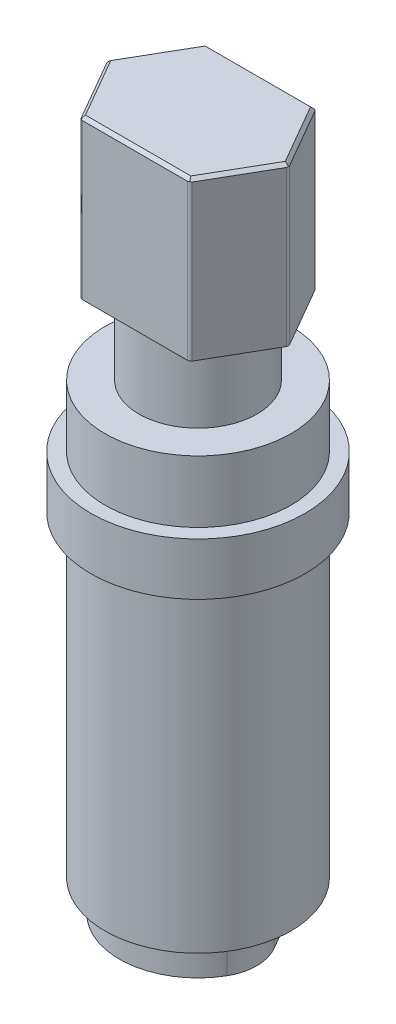
ISO-10303-21;
HEADER;
FILE_DESCRIPTION(('STEP AP214'),'2;1');
FILE_NAME('part.step','',(''),(''),'','','');
FILE_SCHEMA(('AUTOMOTIVE_DESIGN { 1 0 10303 214 1 1 1 1 }'));
ENDSEC;
DATA;
#1=APPLICATION_CONTEXT('core data for automotive mechanical design processes');
#2=APPLICATION_PROTOCOL_DEFINITION('international standard','automotive_design',2000,#1);
#3=PRODUCT_CONTEXT('',#1,'mechanical');
#4=PRODUCT('Part','Part','',(#3));
#5=PRODUCT_RELATED_PRODUCT_CATEGORY('part','',(#4));
#6=PRODUCT_DEFINITION_FORMATION('','',#4);
#7=PRODUCT_DEFINITION_CONTEXT('part definition',#1,'design');
#8=PRODUCT_DEFINITION('design','',#6,#7);
#9=PRODUCT_DEFINITION_SHAPE('','',#8);
#10=(LENGTH_UNIT() NAMED_UNIT(*) SI_UNIT(.MILLI.,.METRE.));
#11=(NAMED_UNIT(*) PLANE_ANGLE_UNIT() SI_UNIT($,.RADIAN.));
#12=(NAMED_UNIT(*) SI_UNIT($,.STERADIAN.) SOLID_ANGLE_UNIT());
#13=UNCERTAINTY_MEASURE_WITH_UNIT(LENGTH_MEASURE(1.E-05),#10,'distance_accuracy_value','');
#14=(GEOMETRIC_REPRESENTATION_CONTEXT(3) GLOBAL_UNCERTAINTY_ASSIGNED_CONTEXT((#13)) GLOBAL_UNIT_ASSIGNED_CONTEXT((#10,
#11,#12)) REPRESENTATION_CONTEXT('',''));
#15=CARTESIAN_POINT('',(0.,0.,0.));
#16=DIRECTION('',(0.,0.,1.));
#17=DIRECTION('',(1.,0.,0.));
#18=AXIS2_PLACEMENT_3D('',#15,#16,#17);
#19=CARTESIAN_POINT('',(0.,19.05,0.));
#20=DIRECTION('',(0.,-1.,0.));
#21=DIRECTION('',(0.,0.,-1.));
#22=AXIS2_PLACEMENT_3D('',#19,#20,#21);
#23=CYLINDRICAL_SURFACE('',#22,3.2004);
#24=CARTESIAN_POINT('',(0.,27.621700408,0.));
#25=DIRECTION('',(0.,-1.,0.));
#26=DIRECTION('',(0.,0.,-1.));
#27=AXIS2_PLACEMENT_3D('',#24,#25,#26);
#28=CIRCLE('',#27,3.2004);
#29=CARTESIAN_POINT('',(0.,27.621700408,-3.2004));
#30=VERTEX_POINT('',#29);
#31=EDGE_CURVE('E312',#30,#30,#28,.T.);
#32=ORIENTED_EDGE('',*,*,#31,.T.);
#33=EDGE_LOOP('',(#32));
#34=FACE_BOUND('',#33,.T.);
#35=CARTESIAN_POINT('',(0.,37.285900282,0.));
#36=DIRECTION('',(0.,1.,0.));
#37=DIRECTION('',(0.,0.,1.));
#38=AXIS2_PLACEMENT_3D('',#35,#36,#37);
#39=CIRCLE('',#38,3.2004);
#40=CARTESIAN_POINT('',(0.,37.285900282,3.2004));
#41=VERTEX_POINT('',#40);
#42=EDGE_CURVE('E316',#41,#41,#39,.F.);
#43=ORIENTED_EDGE('',*,*,#42,.F.);
#44=EDGE_LOOP('',(#43));
#45=FACE_BOUND('',#44,.T.);
#46=ADVANCED_FACE('F17',(#34,#45),#23,.F.);
#47=CARTESIAN_POINT('',(-4.7625,37.285900282,0.));
#48=DIRECTION('',(0.,-1.,0.));
#49=DIRECTION('',(0.,0.,-1.));
#50=AXIS2_PLACEMENT_3D('',#47,#48,#49);
#51=PLANE('',#50);
#52=CARTESIAN_POINT('',(0.,37.285900282,0.));
#53=DIRECTION('',(0.,-1.,0.));
#54=DIRECTION('',(0.,0.,-1.));
#55=AXIS2_PLACEMENT_3D('',#52,#53,#54);
#56=CIRCLE('',#55,7.499999986);
#57=CARTESIAN_POINT('',(0.,37.285900282,-7.499999986));
#58=VERTEX_POINT('',#57);
#59=EDGE_CURVE('E255',#58,#58,#56,.T.);
#60=ORIENTED_EDGE('',*,*,#59,.F.);
#61=EDGE_LOOP('',(#60));
#62=FACE_BOUND('',#61,.T.);
#63=CARTESIAN_POINT('',(0.,37.285900282,0.));
#64=DIRECTION('',(0.,1.,0.));
#65=DIRECTION('',(0.,0.,1.));
#66=AXIS2_PLACEMENT_3D('',#63,#64,#65);
#67=CIRCLE('',#66,4.7625);
#68=CARTESIAN_POINT('',(0.,37.285900282,4.7625));
#69=VERTEX_POINT('',#68);
#70=EDGE_CURVE('E394',#69,#69,#67,.T.);
#71=ORIENTED_EDGE('',*,*,#70,.F.);
#72=EDGE_LOOP('',(#71));
#73=FACE_BOUND('',#72,.T.);
#74=ADVANCED_FACE('F527',(#62,#73),#51,.F.);
#75=CARTESIAN_POINT('',(-3.2004,27.621700408,0.));
#76=DIRECTION('',(0.,-1.,0.));
#77=DIRECTION('',(0.,0.,-1.));
#78=AXIS2_PLACEMENT_3D('',#75,#76,#77);
#79=PLANE('',#78);
#80=CARTESIAN_POINT('',(0.,27.621700408,0.));
#81=DIRECTION('',(0.,-1.,0.));
#82=DIRECTION('',(0.,0.,-1.));
#83=AXIS2_PLACEMENT_3D('',#80,#81,#82);
#84=CIRCLE('',#83,2.5527);
#85=CARTESIAN_POINT('',(0.,27.621700408,-2.5527));
#86=VERTEX_POINT('',#85);
#87=EDGE_CURVE('E263',#86,#86,#84,.T.);
#88=ORIENTED_EDGE('',*,*,#87,.T.);
#89=EDGE_LOOP('',(#88));
#90=FACE_BOUND('',#89,.T.);
#91=ORIENTED_EDGE('',*,*,#31,.F.);
#92=EDGE_LOOP('',(#91));
#93=FACE_BOUND('',#92,.T.);
#94=ADVANCED_FACE('F529',(#90,#93),#79,.F.);
#95=CARTESIAN_POINT('',(-7.499999986,2.54,0.));
#96=DIRECTION('',(0.,1.,0.));
#97=DIRECTION('',(0.,0.,1.));
#98=AXIS2_PLACEMENT_3D('',#95,#96,#97);
#99=PLANE('',#98);
#100=CARTESIAN_POINT('',(0.,2.54,0.));
#101=DIRECTION('',(0.,-1.,0.));
#102=DIRECTION('',(0.,0.,-1.));
#103=AXIS2_PLACEMENT_3D('',#100,#101,#102);
#104=CIRCLE('',#103,7.499999986);
#105=CARTESIAN_POINT('',(0.,2.54,-7.499999986));
#106=VERTEX_POINT('',#105);
#107=EDGE_CURVE('E296',#106,#106,#104,.T.);
#108=ORIENTED_EDGE('',*,*,#107,.T.);
#109=EDGE_LOOP('',(#108));
#110=FACE_BOUND('',#109,.T.);
#111=DIRECTION('',(0.5,0.,-0.866025403784439));
#112=VECTOR('',#111,1.);
#113=CARTESIAN_POINT('',(-5.49926131403119,2.54,-0.635));
#114=LINE('',#113,#112);
#115=CARTESIAN_POINT('',(-5.49926131403119,2.54,-0.635));
#116=VERTEX_POINT('',#115);
#117=CARTESIAN_POINT('',(-3.29955678841871,2.54,-4.445));
#118=VERTEX_POINT('',#117);
#119=EDGE_CURVE('E245',#116,#118,#114,.T.);
#120=ORIENTED_EDGE('',*,*,#119,.F.);
#121=CARTESIAN_POINT('',(-2.19970452561247,2.54,1.27));
#122=DIRECTION('',(0.,1.,0.));
#123=DIRECTION('',(0.,0.,1.));
#124=AXIS2_PLACEMENT_3D('',#121,#122,#123);
#125=CIRCLE('',#124,3.81);
#126=CARTESIAN_POINT('',(-5.49926131403119,2.54,3.175));
#127=VERTEX_POINT('',#126);
#128=EDGE_CURVE('E252',#127,#116,#125,.F.);
#129=ORIENTED_EDGE('',*,*,#128,.F.);
#130=CARTESIAN_POINT('',(0.,2.54,0.));
#131=DIRECTION('',(0.,1.,0.));
#132=DIRECTION('',(0.,0.,1.));
#133=AXIS2_PLACEMENT_3D('',#130,#131,#132);
#134=CIRCLE('',#133,6.35);
#135=CARTESIAN_POINT('',(5.49926131403119,2.54,3.175));
#136=VERTEX_POINT('',#135);
#137=EDGE_CURVE('E256',#136,#127,#134,.F.);
#138=ORIENTED_EDGE('',*,*,#137,.F.);
#139=CARTESIAN_POINT('',(2.19970452561247,2.54,1.27));
#140=DIRECTION('',(0.,1.,0.));
#141=DIRECTION('',(0.,0.,1.));
#142=AXIS2_PLACEMENT_3D('',#139,#140,#141);
#143=CIRCLE('',#142,3.81);
#144=CARTESIAN_POINT('',(5.49926131403119,2.54,-0.635));
#145=VERTEX_POINT('',#144);
#146=EDGE_CURVE('E239',#145,#136,#143,.F.);
#147=ORIENTED_EDGE('',*,*,#146,.F.);
#148=DIRECTION('',(0.5,0.,0.866025403784439));
#149=VECTOR('',#148,1.);
#150=CARTESIAN_POINT('',(3.29955678841871,2.54,-4.445));
#151=LINE('',#150,#149);
#152=CARTESIAN_POINT('',(3.29955678841871,2.54,-4.445));
#153=VERTEX_POINT('',#152);
#154=EDGE_CURVE('E224',#153,#145,#151,.T.);
#155=ORIENTED_EDGE('',*,*,#154,.F.);
#156=CARTESIAN_POINT('',(0.,2.54,-2.54));
#157=DIRECTION('',(0.,1.,0.));
#158=DIRECTION('',(0.,0.,1.));
#159=AXIS2_PLACEMENT_3D('',#156,#157,#158);
#160=CIRCLE('',#159,3.81);
#161=EDGE_CURVE('E236',#118,#153,#160,.F.);
#162=ORIENTED_EDGE('',*,*,#161,.F.);
#163=EDGE_LOOP('',(#120,#129,#138,#147,#155,#162));
#164=FACE_BOUND('',#163,.T.);
#165=ADVANCED_FACE('F235',(#110,#164),#99,.F.);
#166=CARTESIAN_POINT('',(0.,19.05,0.));
#167=DIRECTION('',(0.,-1.,0.));
#168=DIRECTION('',(0.,0.,-1.));
#169=AXIS2_PLACEMENT_3D('',#166,#167,#168);
#170=CYLINDRICAL_SURFACE('',#169,7.499999986);
#171=ORIENTED_EDGE('',*,*,#107,.F.);
#172=EDGE_LOOP('',(#171));
#173=FACE_BOUND('',#172,.T.);
#174=CARTESIAN_POINT('',(0.,28.067,0.));
#175=DIRECTION('',(0.,-1.,0.));
#176=DIRECTION('',(0.,0.,-1.));
#177=AXIS2_PLACEMENT_3D('',#174,#175,#176);
#178=CIRCLE('',#177,7.499999986);
#179=CARTESIAN_POINT('',(0.,28.067,-7.499999986));
#180=VERTEX_POINT('',#179);
#181=EDGE_CURVE('E292',#180,#180,#178,.T.);
#182=ORIENTED_EDGE('',*,*,#181,.T.);
#183=EDGE_LOOP('',(#182));
#184=FACE_BOUND('',#183,.T.);
#185=ADVANCED_FACE('F560',(#173,#184),#170,.T.);
#186=CARTESIAN_POINT('',(-8.636,28.067,0.));
#187=DIRECTION('',(0.,1.,0.));
#188=DIRECTION('',(0.,0.,1.));
#189=AXIS2_PLACEMENT_3D('',#186,#187,#188);
#190=PLANE('',#189);
#191=ORIENTED_EDGE('',*,*,#181,.F.);
#192=EDGE_LOOP('',(#191));
#193=FACE_BOUND('',#192,.T.);
#194=CARTESIAN_POINT('',(0.,28.067,0.));
#195=DIRECTION('',(0.,-1.,0.));
#196=DIRECTION('',(0.,0.,-1.));
#197=AXIS2_PLACEMENT_3D('',#194,#195,#196);
#198=CIRCLE('',#197,8.636);
#199=CARTESIAN_POINT('',(0.,28.067,-8.636));
#200=VERTEX_POINT('',#199);
#201=EDGE_CURVE('E288',#200,#200,#198,.T.);
#202=ORIENTED_EDGE('',*,*,#201,.T.);
#203=EDGE_LOOP('',(#202));
#204=FACE_BOUND('',#203,.T.);
#205=ADVANCED_FACE('F556',(#193,#204),#190,.F.);
#206=CARTESIAN_POINT('',(0.,19.05,0.));
#207=DIRECTION('',(0.,-1.,0.));
#208=DIRECTION('',(0.,0.,-1.));
#209=AXIS2_PLACEMENT_3D('',#206,#207,#208);
#210=CYLINDRICAL_SURFACE('',#209,8.636);
#211=ORIENTED_EDGE('',*,*,#201,.F.);
#212=EDGE_LOOP('',(#211));
#213=FACE_BOUND('',#212,.T.);
#214=CARTESIAN_POINT('',(0.,32.285900376,0.));
#215=DIRECTION('',(0.,-1.,0.));
#216=DIRECTION('',(0.,0.,-1.));
#217=AXIS2_PLACEMENT_3D('',#214,#215,#216);
#218=CIRCLE('',#217,8.636);
#219=CARTESIAN_POINT('',(0.,32.285900376,-8.636));
#220=VERTEX_POINT('',#219);
#221=EDGE_CURVE('E284',#220,#220,#218,.T.);
#222=ORIENTED_EDGE('',*,*,#221,.T.);
#223=EDGE_LOOP('',(#222));
#224=FACE_BOUND('',#223,.T.);
#225=ADVANCED_FACE('F552',(#213,#224),#210,.T.);
#226=CARTESIAN_POINT('',(-8.636,32.285900376,0.));
#227=DIRECTION('',(0.,-1.,0.));
#228=DIRECTION('',(0.,0.,-1.));
#229=AXIS2_PLACEMENT_3D('',#226,#227,#228);
#230=PLANE('',#229);
#231=ORIENTED_EDGE('',*,*,#221,.F.);
#232=EDGE_LOOP('',(#231));
#233=FACE_BOUND('',#232,.T.);
#234=CARTESIAN_POINT('',(0.,32.285900376,0.));
#235=DIRECTION('',(0.,-1.,0.));
#236=DIRECTION('',(0.,0.,-1.));
#237=AXIS2_PLACEMENT_3D('',#234,#235,#236);
#238=CIRCLE('',#237,7.499999986);
#239=CARTESIAN_POINT('',(0.,32.285900376,-7.499999986));
#240=VERTEX_POINT('',#239);
#241=EDGE_CURVE('E280',#240,#240,#238,.T.);
#242=ORIENTED_EDGE('',*,*,#241,.T.);
#243=EDGE_LOOP('',(#242));
#244=FACE_BOUND('',#243,.T.);
#245=ADVANCED_FACE('F548',(#233,#244),#230,.F.);
#246=CARTESIAN_POINT('',(0.,19.05,0.));
#247=DIRECTION('',(0.,-1.,0.));
#248=DIRECTION('',(0.,0.,-1.));
#249=AXIS2_PLACEMENT_3D('',#246,#247,#248);
#250=CYLINDRICAL_SURFACE('',#249,7.499999986);
#251=ORIENTED_EDGE('',*,*,#241,.F.);
#252=EDGE_LOOP('',(#251));
#253=FACE_BOUND('',#252,.T.);
#254=ORIENTED_EDGE('',*,*,#59,.T.);
#255=EDGE_LOOP('',(#254));
#256=FACE_BOUND('',#255,.T.);
#257=ADVANCED_FACE('F545',(#253,#256),#250,.T.);
#258=CARTESIAN_POINT('',(0.,23.6095192980614,-2.54));
#259=DIRECTION('',(0.,-1.,0.));
#260=DIRECTION('',(0.,0.,-1.));
#261=AXIS2_PLACEMENT_3D('',#258,#259,#260);
#262=CYLINDRICAL_SURFACE('',#261,3.81);
#263=ORIENTED_EDGE('',*,*,#161,.T.);
#264=DIRECTION('',(0.,-1.,0.));
#265=VECTOR('',#264,1.);
#266=CARTESIAN_POINT('',(3.29955678841871,23.6095192980614,-4.445));
#267=LINE('',#266,#265);
#268=CARTESIAN_POINT('',(3.29955678841871,0.,-4.445));
#269=VERTEX_POINT('',#268);
#270=EDGE_CURVE('E220',#153,#269,#267,.T.);
#271=ORIENTED_EDGE('',*,*,#270,.T.);
#272=CARTESIAN_POINT('',(0.,0.,-2.54));
#273=DIRECTION('',(0.,-1.,0.));
#274=DIRECTION('',(0.,0.,-1.));
#275=AXIS2_PLACEMENT_3D('',#272,#273,#274);
#276=CIRCLE('',#275,3.81);
#277=CARTESIAN_POINT('',(-3.29955678841871,0.,-4.445));
#278=VERTEX_POINT('',#277);
#279=EDGE_CURVE('E249',#278,#269,#276,.T.);
#280=ORIENTED_EDGE('',*,*,#279,.F.);
#281=DIRECTION('',(0.,-1.,0.));
#282=VECTOR('',#281,1.);
#283=CARTESIAN_POINT('',(-3.29955678841871,23.6095192980614,-4.445));
#284=LINE('',#283,#282);
#285=EDGE_CURVE('E243',#118,#278,#284,.T.);
#286=ORIENTED_EDGE('',*,*,#285,.F.);
#287=EDGE_LOOP('',(#263,#271,#280,#286));
#288=FACE_BOUND('',#287,.T.);
#289=ADVANCED_FACE('F242',(#288),#262,.T.);
#290=CARTESIAN_POINT('',(-5.49926131403119,23.6095192980614,-0.635));
#291=DIRECTION('',(-0.866025403784439,0.,-0.5));
#292=DIRECTION('',(-0.5,0.,0.866025403784439));
#293=AXIS2_PLACEMENT_3D('',#290,#291,#292);
#294=PLANE('',#293);
#295=ORIENTED_EDGE('',*,*,#119,.T.);
#296=ORIENTED_EDGE('',*,*,#285,.T.);
#297=DIRECTION('',(0.5,0.,-0.866025403784439));
#298=VECTOR('',#297,1.);
#299=CARTESIAN_POINT('',(-5.49926131403119,0.,-0.635));
#300=LINE('',#299,#298);
#301=CARTESIAN_POINT('',(-5.49926131403119,0.,-0.635));
#302=VERTEX_POINT('',#301);
#303=EDGE_CURVE('E266',#302,#278,#300,.T.);
#304=ORIENTED_EDGE('',*,*,#303,.F.);
#305=DIRECTION('',(0.,-1.,0.));
#306=VECTOR('',#305,1.);
#307=CARTESIAN_POINT('',(-5.49926131403119,23.6095192980614,-0.635));
#308=LINE('',#307,#306);
#309=EDGE_CURVE('E264',#116,#302,#308,.T.);
#310=ORIENTED_EDGE('',*,*,#309,.F.);
#311=EDGE_LOOP('',(#295,#296,#304,#310));
#312=FACE_BOUND('',#311,.T.);
#313=ADVANCED_FACE('F730',(#312),#294,.T.);
#314=CARTESIAN_POINT('',(-2.19970452561247,23.6095192980614,1.27));
#315=DIRECTION('',(0.,-1.,0.));
#316=DIRECTION('',(0.,0.,-1.));
#317=AXIS2_PLACEMENT_3D('',#314,#315,#316);
#318=CYLINDRICAL_SURFACE('',#317,3.81);
#319=ORIENTED_EDGE('',*,*,#128,.T.);
#320=ORIENTED_EDGE('',*,*,#309,.T.);
#321=CARTESIAN_POINT('',(-2.19970452561247,0.,1.27));
#322=DIRECTION('',(0.,-1.,0.));
#323=DIRECTION('',(0.,0.,-1.));
#324=AXIS2_PLACEMENT_3D('',#321,#322,#323);
#325=CIRCLE('',#324,3.81);
#326=CARTESIAN_POINT('',(-5.49926131403119,0.,3.175));
#327=VERTEX_POINT('',#326);
#328=EDGE_CURVE('E269',#327,#302,#325,.T.);
#329=ORIENTED_EDGE('',*,*,#328,.F.);
#330=DIRECTION('',(0.,-1.,0.));
#331=VECTOR('',#330,1.);
#332=CARTESIAN_POINT('',(-5.49926131403119,23.6095192980614,3.175));
#333=LINE('',#332,#331);
#334=EDGE_CURVE('E267',#127,#327,#333,.T.);
#335=ORIENTED_EDGE('',*,*,#334,.F.);
#336=EDGE_LOOP('',(#319,#320,#329,#335));
#337=FACE_BOUND('',#336,.T.);
#338=ADVANCED_FACE('F727',(#337),#318,.T.);
#339=CARTESIAN_POINT('',(0.,23.6095192980614,0.));
#340=DIRECTION('',(0.,-1.,0.));
#341=DIRECTION('',(0.,0.,-1.));
#342=AXIS2_PLACEMENT_3D('',#339,#340,#341);
#343=CYLINDRICAL_SURFACE('',#342,6.35);
#344=ORIENTED_EDGE('',*,*,#137,.T.);
#345=ORIENTED_EDGE('',*,*,#334,.T.);
#346=CARTESIAN_POINT('',(0.,0.,0.));
#347=DIRECTION('',(0.,-1.,0.));
#348=DIRECTION('',(0.,0.,-1.));
#349=AXIS2_PLACEMENT_3D('',#346,#347,#348);
#350=CIRCLE('',#349,6.35);
#351=CARTESIAN_POINT('',(5.49926131403119,0.,3.175));
#352=VERTEX_POINT('',#351);
#353=EDGE_CURVE('E273',#352,#327,#350,.T.);
#354=ORIENTED_EDGE('',*,*,#353,.F.);
#355=DIRECTION('',(0.,-1.,0.));
#356=VECTOR('',#355,1.);
#357=CARTESIAN_POINT('',(5.49926131403119,23.6095192980614,3.175));
#358=LINE('',#357,#356);
#359=EDGE_CURVE('E270',#136,#352,#358,.T.);
#360=ORIENTED_EDGE('',*,*,#359,.F.);
#361=EDGE_LOOP('',(#344,#345,#354,#360));
#362=FACE_BOUND('',#361,.T.);
#363=ADVANCED_FACE('F723',(#362),#343,.T.);
#364=CARTESIAN_POINT('',(2.19970452561247,23.6095192980614,1.27));
#365=DIRECTION('',(0.,-1.,0.));
#366=DIRECTION('',(0.,0.,-1.));
#367=AXIS2_PLACEMENT_3D('',#364,#365,#366);
#368=CYLINDRICAL_SURFACE('',#367,3.81);
#369=ORIENTED_EDGE('',*,*,#146,.T.);
#370=ORIENTED_EDGE('',*,*,#359,.T.);
#371=CARTESIAN_POINT('',(2.19970452561247,0.,1.27));
#372=DIRECTION('',(0.,-1.,0.));
#373=DIRECTION('',(0.,0.,-1.));
#374=AXIS2_PLACEMENT_3D('',#371,#372,#373);
#375=CIRCLE('',#374,3.81);
#376=CARTESIAN_POINT('',(5.49926131403119,0.,-0.635));
#377=VERTEX_POINT('',#376);
#378=EDGE_CURVE('E231',#377,#352,#375,.T.);
#379=ORIENTED_EDGE('',*,*,#378,.F.);
#380=DIRECTION('',(0.,-1.,0.));
#381=VECTOR('',#380,1.);
#382=CARTESIAN_POINT('',(5.49926131403119,23.6095192980614,-0.635));
#383=LINE('',#382,#381);
#384=EDGE_CURVE('E274',#145,#377,#383,.T.);
#385=ORIENTED_EDGE('',*,*,#384,.F.);
#386=EDGE_LOOP('',(#369,#370,#379,#385));
#387=FACE_BOUND('',#386,.T.);
#388=ADVANCED_FACE('F720',(#387),#368,.T.);
#389=CARTESIAN_POINT('',(3.29955678841871,23.6095192980614,-4.445));
#390=DIRECTION('',(0.866025403784439,0.,-0.5));
#391=DIRECTION('',(-0.5,0.,-0.866025403784439));
#392=AXIS2_PLACEMENT_3D('',#389,#390,#391);
#393=PLANE('',#392);
#394=ORIENTED_EDGE('',*,*,#154,.T.);
#395=ORIENTED_EDGE('',*,*,#384,.T.);
#396=DIRECTION('',(0.5,0.,0.866025403784439));
#397=VECTOR('',#396,1.);
#398=CARTESIAN_POINT('',(3.29955678841871,0.,-4.445));
#399=LINE('',#398,#397);
#400=EDGE_CURVE('E226',#269,#377,#399,.T.);
#401=ORIENTED_EDGE('',*,*,#400,.F.);
#402=ORIENTED_EDGE('',*,*,#270,.F.);
#403=EDGE_LOOP('',(#394,#395,#401,#402));
#404=FACE_BOUND('',#403,.T.);
#405=ADVANCED_FACE('F222',(#404),#393,.T.);
#406=CARTESIAN_POINT('',(0.,19.05,0.));
#407=DIRECTION('',(0.,-1.,0.));
#408=DIRECTION('',(0.,0.,-1.));
#409=AXIS2_PLACEMENT_3D('',#406,#407,#408);
#410=CYLINDRICAL_SURFACE('',#409,2.5527);
#411=CARTESIAN_POINT('',(0.,6.35,0.));
#412=DIRECTION('',(0.,-1.,0.));
#413=DIRECTION('',(0.,0.,-1.));
#414=AXIS2_PLACEMENT_3D('',#411,#412,#413);
#415=CIRCLE('',#414,2.5527);
#416=CARTESIAN_POINT('',(0.,6.35,-2.5527));
#417=VERTEX_POINT('',#416);
#418=EDGE_CURVE('E308',#417,#417,#415,.T.);
#419=ORIENTED_EDGE('',*,*,#418,.T.);
#420=EDGE_LOOP('',(#419));
#421=FACE_BOUND('',#420,.T.);
#422=ORIENTED_EDGE('',*,*,#87,.F.);
#423=EDGE_LOOP('',(#422));
#424=FACE_BOUND('',#423,.T.);
#425=ADVANCED_FACE('F580',(#421,#424),#410,.F.);
#426=CARTESIAN_POINT('',(-2.5527,6.35,0.));
#427=DIRECTION('',(0.,1.,0.));
#428=DIRECTION('',(0.,0.,1.));
#429=AXIS2_PLACEMENT_3D('',#426,#427,#428);
#430=PLANE('',#429);
#431=ORIENTED_EDGE('',*,*,#418,.F.);
#432=EDGE_LOOP('',(#431));
#433=FACE_BOUND('',#432,.T.);
#434=CARTESIAN_POINT('',(0.,6.35,0.));
#435=DIRECTION('',(0.,-1.,0.));
#436=DIRECTION('',(0.,0.,-1.));
#437=AXIS2_PLACEMENT_3D('',#434,#435,#436);
#438=CIRCLE('',#437,3.2639);
#439=CARTESIAN_POINT('',(0.,6.35,-3.2639));
#440=VERTEX_POINT('',#439);
#441=EDGE_CURVE('E304',#440,#440,#438,.T.);
#442=ORIENTED_EDGE('',*,*,#441,.T.);
#443=EDGE_LOOP('',(#442));
#444=FACE_BOUND('',#443,.T.);
#445=ADVANCED_FACE('F576',(#433,#444),#430,.F.);
#446=CARTESIAN_POINT('',(0.,19.05,0.));
#447=DIRECTION('',(0.,-1.,0.));
#448=DIRECTION('',(0.,0.,-1.));
#449=AXIS2_PLACEMENT_3D('',#446,#447,#448);
#450=CYLINDRICAL_SURFACE('',#449,3.2639);
#451=ORIENTED_EDGE('',*,*,#441,.F.);
#452=EDGE_LOOP('',(#451));
#453=FACE_BOUND('',#452,.T.);
#454=CARTESIAN_POINT('',(0.,0.,0.));
#455=DIRECTION('',(0.,-1.,0.));
#456=DIRECTION('',(0.,0.,-1.));
#457=AXIS2_PLACEMENT_3D('',#454,#455,#456);
#458=CIRCLE('',#457,3.2639);
#459=CARTESIAN_POINT('',(0.,0.,-3.2639));
#460=VERTEX_POINT('',#459);
#461=EDGE_CURVE('E300',#460,#460,#458,.T.);
#462=ORIENTED_EDGE('',*,*,#461,.T.);
#463=EDGE_LOOP('',(#462));
#464=FACE_BOUND('',#463,.T.);
#465=ADVANCED_FACE('F572',(#453,#464),#450,.F.);
#466=CARTESIAN_POINT('',(-7.449199986,0.,0.));
#467=DIRECTION('',(0.,1.,0.));
#468=DIRECTION('',(0.,0.,1.));
#469=AXIS2_PLACEMENT_3D('',#466,#467,#468);
#470=PLANE('',#469);
#471=ORIENTED_EDGE('',*,*,#461,.F.);
#472=EDGE_LOOP('',(#471));
#473=FACE_BOUND('',#472,.T.);
#474=ORIENTED_EDGE('',*,*,#279,.T.);
#475=ORIENTED_EDGE('',*,*,#400,.T.);
#476=ORIENTED_EDGE('',*,*,#378,.T.);
#477=ORIENTED_EDGE('',*,*,#353,.T.);
#478=ORIENTED_EDGE('',*,*,#328,.T.);
#479=ORIENTED_EDGE('',*,*,#303,.T.);
#480=EDGE_LOOP('',(#474,#475,#476,#477,#478,#479));
#481=FACE_BOUND('',#480,.T.);
#482=ADVANCED_FACE('F568',(#473,#481),#470,.F.);
#483=CARTESIAN_POINT('',(0.,37.285900282,0.));
#484=DIRECTION('',(0.,1.,0.));
#485=DIRECTION('',(0.,0.,1.));
#486=AXIS2_PLACEMENT_3D('',#483,#484,#485);
#487=PLANE('',#486);
#488=ORIENTED_EDGE('',*,*,#42,.T.);
#489=EDGE_LOOP('',(#488));
#490=FACE_BOUND('',#489,.T.);
#491=ADVANCED_FACE('F571',(#490),#487,.F.);
#492=CARTESIAN_POINT('',(0.,43.318400282,0.));
#493=DIRECTION('',(0.,1.,0.));
#494=DIRECTION('',(0.,0.,1.));
#495=AXIS2_PLACEMENT_3D('',#492,#493,#494);
#496=PLANE('',#495);
#497=CARTESIAN_POINT('',(0.,43.318400282,0.));
#498=DIRECTION('',(0.,1.,0.));
#499=DIRECTION('',(0.,0.,1.));
#500=AXIS2_PLACEMENT_3D('',#497,#498,#499);
#501=CIRCLE('',#500,4.7625);
#502=CARTESIAN_POINT('',(0.,43.318400282,4.7625));
#503=VERTEX_POINT('',#502);
#504=EDGE_CURVE('E492',#503,#503,#501,.T.);
#505=ORIENTED_EDGE('',*,*,#504,.T.);
#506=EDGE_LOOP('',(#505));
#507=FACE_BOUND('',#506,.T.);
#508=DIRECTION('',(1.,0.,0.));
#509=VECTOR('',#508,1.);
#510=CARTESIAN_POINT('',(-4.39940905122495,43.318400282,5.08));
#511=LINE('',#510,#509);
#512=CARTESIAN_POINT('',(-4.25276208285078,43.318400282,5.08));
#513=VERTEX_POINT('',#512);
#514=CARTESIAN_POINT('',(4.25276208285078,43.318400282,5.08));
#515=VERTEX_POINT('',#514);
#516=EDGE_CURVE('E320',#513,#515,#511,.T.);
#517=ORIENTED_EDGE('',*,*,#516,.F.);
#518=CARTESIAN_POINT('',(-4.25276208285078,43.318400282,4.826));
#519=DIRECTION('',(0.,1.,0.));
#520=DIRECTION('',(0.,0.,1.));
#521=AXIS2_PLACEMENT_3D('',#518,#519,#520);
#522=CIRCLE('',#521,0.254);
#523=CARTESIAN_POINT('',(-4.47273253541204,43.318400282,4.953));
#524=VERTEX_POINT('',#523);
#525=EDGE_CURVE('E436',#513,#524,#522,.F.);
#526=ORIENTED_EDGE('',*,*,#525,.T.);
#527=DIRECTION('',(0.5,0.,0.866025403784439));
#528=VECTOR('',#527,1.);
#529=CARTESIAN_POINT('',(-7.33234841870825,43.318400282,0.));
#530=LINE('',#529,#528);
#531=CARTESIAN_POINT('',(-7.25902493452117,43.318400282,0.127));
#532=VERTEX_POINT('',#531);
#533=EDGE_CURVE('E489',#532,#524,#530,.T.);
#534=ORIENTED_EDGE('',*,*,#533,.F.);
#535=CARTESIAN_POINT('',(-7.03905448195992,43.318400282,0.));
#536=DIRECTION('',(0.,1.,0.));
#537=DIRECTION('',(0.,0.,1.));
#538=AXIS2_PLACEMENT_3D('',#535,#536,#537);
#539=CIRCLE('',#538,0.254);
#540=CARTESIAN_POINT('',(-7.25902493452117,43.318400282,-0.127));
#541=VERTEX_POINT('',#540);
#542=EDGE_CURVE('E424',#532,#541,#539,.F.);
#543=ORIENTED_EDGE('',*,*,#542,.T.);
#544=DIRECTION('',(-0.5,0.,0.866025403784439));
#545=VECTOR('',#544,1.);
#546=CARTESIAN_POINT('',(-3.66617420935412,43.318400282,-6.35));
#547=LINE('',#546,#545);
#548=CARTESIAN_POINT('',(-4.47273253541204,43.318400282,-4.953));
#549=VERTEX_POINT('',#548);
#550=EDGE_CURVE('E487',#549,#541,#547,.T.);
#551=ORIENTED_EDGE('',*,*,#550,.F.);
#552=CARTESIAN_POINT('',(-4.25276208285078,43.318400282,-4.826));
#553=DIRECTION('',(0.,1.,0.));
#554=DIRECTION('',(0.,0.,1.));
#555=AXIS2_PLACEMENT_3D('',#552,#553,#554);
#556=CIRCLE('',#555,0.254);
#557=CARTESIAN_POINT('',(-4.25276208285078,43.318400282,-5.08));
#558=VERTEX_POINT('',#557);
#559=EDGE_CURVE('E427',#549,#558,#556,.F.);
#560=ORIENTED_EDGE('',*,*,#559,.T.);
#561=DIRECTION('',(-1.,0.,0.));
#562=VECTOR('',#561,1.);
#563=CARTESIAN_POINT('',(-4.39940905122495,43.318400282,-5.08));
#564=LINE('',#563,#562);
#565=CARTESIAN_POINT('',(4.25276208285078,43.318400282,-5.08));
#566=VERTEX_POINT('',#565);
#567=EDGE_CURVE('E324',#566,#558,#564,.T.);
#568=ORIENTED_EDGE('',*,*,#567,.F.);
#569=CARTESIAN_POINT('',(4.25276208285078,43.318400282,-4.826));
#570=DIRECTION('',(0.,1.,0.));
#571=DIRECTION('',(0.,0.,1.));
#572=AXIS2_PLACEMENT_3D('',#569,#570,#571);
#573=CIRCLE('',#572,0.254);
#574=CARTESIAN_POINT('',(4.47273253541203,43.318400282,-4.953));
#575=VERTEX_POINT('',#574);
#576=EDGE_CURVE('E430',#566,#575,#573,.F.);
#577=ORIENTED_EDGE('',*,*,#576,.T.);
#578=DIRECTION('',(-0.5,0.,-0.866025403784439));
#579=VECTOR('',#578,1.);
#580=CARTESIAN_POINT('',(7.33234841870825,43.318400282,0.));
#581=LINE('',#580,#579);
#582=CARTESIAN_POINT('',(7.25902493452117,43.318400282,-0.127000000000004));
#583=VERTEX_POINT('',#582);
#584=EDGE_CURVE('E490',#583,#575,#581,.T.);
#585=ORIENTED_EDGE('',*,*,#584,.F.);
#586=CARTESIAN_POINT('',(7.03905448195992,43.318400282,0.));
#587=DIRECTION('',(0.,1.,0.));
#588=DIRECTION('',(0.,0.,1.));
#589=AXIS2_PLACEMENT_3D('',#586,#587,#588);
#590=CIRCLE('',#589,0.254);
#591=CARTESIAN_POINT('',(7.25902493452117,43.318400282,0.126999999999997));
#592=VERTEX_POINT('',#591);
#593=EDGE_CURVE('E433',#583,#592,#590,.F.);
#594=ORIENTED_EDGE('',*,*,#593,.T.);
#595=DIRECTION('',(0.5,0.,-0.866025403784439));
#596=VECTOR('',#595,1.);
#597=CARTESIAN_POINT('',(3.66617420935412,43.318400282,6.35));
#598=LINE('',#597,#596);
#599=CARTESIAN_POINT('',(4.47273253541203,43.318400282,4.953));
#600=VERTEX_POINT('',#599);
#601=EDGE_CURVE('E496',#600,#592,#598,.T.);
#602=ORIENTED_EDGE('',*,*,#601,.F.);
#603=CARTESIAN_POINT('',(4.25276208285078,43.318400282,4.826));
#604=DIRECTION('',(0.,1.,0.));
#605=DIRECTION('',(0.,0.,1.));
#606=AXIS2_PLACEMENT_3D('',#603,#604,#605);
#607=CIRCLE('',#606,0.254);
#608=EDGE_CURVE('E421',#600,#515,#607,.F.);
#609=ORIENTED_EDGE('',*,*,#608,.T.);
#610=EDGE_LOOP('',(#517,#526,#534,#543,#551,#560,#568,#577,#585,#594,#602,#609));
#611=FACE_BOUND('',#610,.T.);
#612=ADVANCED_FACE('F669',(#507,#611),#496,.F.);
#613=CARTESIAN_POINT('',(0.,43.318400282,0.));
#614=DIRECTION('',(0.,-1.,0.));
#615=DIRECTION('',(0.,0.,-1.));
#616=AXIS2_PLACEMENT_3D('',#613,#614,#615);
#617=CYLINDRICAL_SURFACE('',#616,4.7625);
#618=ORIENTED_EDGE('',*,*,#504,.F.);
#619=EDGE_LOOP('',(#618));
#620=FACE_BOUND('',#619,.T.);
#621=ORIENTED_EDGE('',*,*,#70,.T.);
#622=EDGE_LOOP('',(#621));
#623=FACE_BOUND('',#622,.T.);
#624=ADVANCED_FACE('F525',(#620,#623),#617,.T.);
#625=CARTESIAN_POINT('',(0.,56.081900282,0.));
#626=DIRECTION('',(0.,1.,0.));
#627=DIRECTION('',(0.,0.,1.));
#628=AXIS2_PLACEMENT_3D('',#625,#626,#627);
#629=PLANE('',#628);
#630=DIRECTION('',(0.5,0.,-0.866025403784439));
#631=VECTOR('',#630,1.);
#632=CARTESIAN_POINT('',(7.112377966147,56.081900282,-0.127000000000002));
#633=LINE('',#632,#631);
#634=CARTESIAN_POINT('',(4.25276208285078,56.081900282,4.826));
#635=VERTEX_POINT('',#634);
#636=CARTESIAN_POINT('',(7.03905448195992,56.081900282,0.));
#637=VERTEX_POINT('',#636);
#638=EDGE_CURVE('E342',#635,#637,#633,.T.);
#639=ORIENTED_EDGE('',*,*,#638,.T.);
#640=DIRECTION('',(-0.5,0.,-0.866025403784439));
#641=VECTOR('',#640,1.);
#642=CARTESIAN_POINT('',(4.17943859866371,56.081900282,-4.953));
#643=LINE('',#642,#641);
#644=CARTESIAN_POINT('',(4.25276208285078,56.081900282,-4.826));
#645=VERTEX_POINT('',#644);
#646=EDGE_CURVE('E345',#637,#645,#643,.T.);
#647=ORIENTED_EDGE('',*,*,#646,.T.);
#648=DIRECTION('',(-1.,0.,0.));
#649=VECTOR('',#648,1.);
#650=CARTESIAN_POINT('',(-4.39940905122495,56.081900282,-4.826));
#651=LINE('',#650,#649);
#652=CARTESIAN_POINT('',(-4.25276208285079,56.081900282,-4.826));
#653=VERTEX_POINT('',#652);
#654=EDGE_CURVE('E328',#645,#653,#651,.T.);
#655=ORIENTED_EDGE('',*,*,#654,.T.);
#656=DIRECTION('',(-0.5,0.,0.866025403784439));
#657=VECTOR('',#656,1.);
#658=CARTESIAN_POINT('',(-7.112377966147,56.081900282,0.126999999999998));
#659=LINE('',#658,#657);
#660=CARTESIAN_POINT('',(-7.03905448195992,56.081900282,0.));
#661=VERTEX_POINT('',#660);
#662=EDGE_CURVE('E332',#653,#661,#659,.T.);
#663=ORIENTED_EDGE('',*,*,#662,.T.);
#664=DIRECTION('',(0.5,0.,0.866025403784439));
#665=VECTOR('',#664,1.);
#666=CARTESIAN_POINT('',(-4.17943859866371,56.081900282,4.953));
#667=LINE('',#666,#665);
#668=CARTESIAN_POINT('',(-4.25276208285079,56.081900282,4.826));
#669=VERTEX_POINT('',#668);
#670=EDGE_CURVE('E336',#661,#669,#667,.T.);
#671=ORIENTED_EDGE('',*,*,#670,.T.);
#672=DIRECTION('',(1.,0.,0.));
#673=VECTOR('',#672,1.);
#674=CARTESIAN_POINT('',(4.39940905122495,56.081900282,4.826));
#675=LINE('',#674,#673);
#676=EDGE_CURVE('E339',#669,#635,#675,.T.);
#677=ORIENTED_EDGE('',*,*,#676,.T.);
#678=EDGE_LOOP('',(#639,#647,#655,#663,#671,#677));
#679=FACE_BOUND('',#678,.T.);
#680=ADVANCED_FACE('F660',(#679),#629,.T.);
#681=CARTESIAN_POINT('',(-4.39940905122495,28.395900282,-5.08));
#682=DIRECTION('',(0.,0.,1.));
#683=DIRECTION('',(1.,0.,0.));
#684=AXIS2_PLACEMENT_3D('',#681,#682,#683);
#685=PLANE('',#684);
#686=DIRECTION('',(1.,0.,0.));
#687=VECTOR('',#686,1.);
#688=CARTESIAN_POINT('',(4.39940905122495,55.827900282,-5.08));
#689=LINE('',#688,#687);
#690=CARTESIAN_POINT('',(-4.25276208285078,55.827900282,-5.08));
#691=VERTEX_POINT('',#690);
#692=CARTESIAN_POINT('',(4.25276208285078,55.827900282,-5.08));
#693=VERTEX_POINT('',#692);
#694=EDGE_CURVE('E368',#691,#693,#689,.T.);
#695=ORIENTED_EDGE('',*,*,#694,.T.);
#696=DIRECTION('',(0.,1.,0.));
#697=VECTOR('',#696,1.);
#698=CARTESIAN_POINT('',(4.25276208285078,28.395900282,-5.08));
#699=LINE('',#698,#697);
#700=EDGE_CURVE('E475',#693,#566,#699,.F.);
#701=ORIENTED_EDGE('',*,*,#700,.T.);
#702=ORIENTED_EDGE('',*,*,#567,.T.);
#703=DIRECTION('',(0.,1.,0.));
#704=VECTOR('',#703,1.);
#705=CARTESIAN_POINT('',(-4.25276208285078,28.395900282,-5.08));
#706=LINE('',#705,#704);
#707=EDGE_CURVE('E471',#558,#691,#706,.T.);
#708=ORIENTED_EDGE('',*,*,#707,.T.);
#709=EDGE_LOOP('',(#695,#701,#702,#708));
#710=FACE_BOUND('',#709,.T.);
#711=ADVANCED_FACE('F699',(#710),#685,.F.);
#712=CARTESIAN_POINT('',(-4.39940905122495,28.395900282,5.08));
#713=DIRECTION('',(0.,0.,-1.));
#714=DIRECTION('',(-1.,0.,0.));
#715=AXIS2_PLACEMENT_3D('',#712,#713,#714);
#716=PLANE('',#715);
#717=DIRECTION('',(-1.,0.,0.));
#718=VECTOR('',#717,1.);
#719=CARTESIAN_POINT('',(-4.39940905122495,55.827900282,5.08));
#720=LINE('',#719,#718);
#721=CARTESIAN_POINT('',(4.25276208285078,55.827900282,5.08));
#722=VERTEX_POINT('',#721);
#723=CARTESIAN_POINT('',(-4.25276208285078,55.827900282,5.08));
#724=VERTEX_POINT('',#723);
#725=EDGE_CURVE('E357',#722,#724,#720,.T.);
#726=ORIENTED_EDGE('',*,*,#725,.T.);
#727=DIRECTION('',(0.,1.,0.));
#728=VECTOR('',#727,1.);
#729=CARTESIAN_POINT('',(-4.25276208285078,28.395900282,5.08));
#730=LINE('',#729,#728);
#731=EDGE_CURVE('E418',#724,#513,#730,.F.);
#732=ORIENTED_EDGE('',*,*,#731,.T.);
#733=ORIENTED_EDGE('',*,*,#516,.T.);
#734=DIRECTION('',(0.,1.,0.));
#735=VECTOR('',#734,1.);
#736=CARTESIAN_POINT('',(4.25276208285078,28.395900282,5.08));
#737=LINE('',#736,#735);
#738=EDGE_CURVE('E414',#515,#722,#737,.T.);
#739=ORIENTED_EDGE('',*,*,#738,.T.);
#740=EDGE_LOOP('',(#726,#732,#733,#739));
#741=FACE_BOUND('',#740,.T.);
#742=ADVANCED_FACE('F680',(#741),#716,.F.);
#743=CARTESIAN_POINT('',(-7.33234841870825,56.081900282,0.));
#744=DIRECTION('',(0.866025403784439,0.,-0.5));
#745=DIRECTION('',(-0.5,0.,-0.866025403784439));
#746=AXIS2_PLACEMENT_3D('',#743,#744,#745);
#747=PLANE('',#746);
#748=ORIENTED_EDGE('',*,*,#533,.T.);
#749=DIRECTION('',(0.,1.,0.));
#750=VECTOR('',#749,1.);
#751=CARTESIAN_POINT('',(-4.47273253541204,56.081900282,4.953));
#752=LINE('',#751,#750);
#753=CARTESIAN_POINT('',(-4.47273253541204,55.827900282,4.953));
#754=VERTEX_POINT('',#753);
#755=EDGE_CURVE('E398',#524,#754,#752,.T.);
#756=ORIENTED_EDGE('',*,*,#755,.T.);
#757=DIRECTION('',(-0.5,0.,-0.866025403784439));
#758=VECTOR('',#757,1.);
#759=CARTESIAN_POINT('',(-7.33234841870825,55.827900282,0.));
#760=LINE('',#759,#758);
#761=CARTESIAN_POINT('',(-7.25902493452117,55.827900282,0.127));
#762=VERTEX_POINT('',#761);
#763=EDGE_CURVE('E361',#754,#762,#760,.T.);
#764=ORIENTED_EDGE('',*,*,#763,.T.);
#765=DIRECTION('',(0.,-1.,0.));
#766=VECTOR('',#765,1.);
#767=CARTESIAN_POINT('',(-7.25902493452117,56.081900282,0.127));
#768=LINE('',#767,#766);
#769=EDGE_CURVE('E372',#762,#532,#768,.T.);
#770=ORIENTED_EDGE('',*,*,#769,.T.);
#771=EDGE_LOOP('',(#748,#756,#764,#770));
#772=FACE_BOUND('',#771,.T.);
#773=ADVANCED_FACE('F673',(#772),#747,.F.);
#774=CARTESIAN_POINT('',(3.66617420935412,56.081900282,6.35));
#775=DIRECTION('',(-0.866025403784439,0.,-0.5));
#776=DIRECTION('',(-0.5,0.,0.866025403784439));
#777=AXIS2_PLACEMENT_3D('',#774,#775,#776);
#778=PLANE('',#777);
#779=ORIENTED_EDGE('',*,*,#601,.T.);
#780=DIRECTION('',(0.,-1.,0.));
#781=VECTOR('',#780,1.);
#782=CARTESIAN_POINT('',(7.25902493452117,56.081900282,0.126999999999996));
#783=LINE('',#782,#781);
#784=CARTESIAN_POINT('',(7.25902493452117,55.827900282,0.126999999999996));
#785=VERTEX_POINT('',#784);
#786=EDGE_CURVE('E450',#592,#785,#783,.F.);
#787=ORIENTED_EDGE('',*,*,#786,.T.);
#788=DIRECTION('',(-0.5,0.,0.866025403784439));
#789=VECTOR('',#788,1.);
#790=CARTESIAN_POINT('',(4.39940905122495,55.827900282,5.08));
#791=LINE('',#790,#789);
#792=CARTESIAN_POINT('',(4.47273253541203,55.827900282,4.953));
#793=VERTEX_POINT('',#792);
#794=EDGE_CURVE('E353',#785,#793,#791,.T.);
#795=ORIENTED_EDGE('',*,*,#794,.T.);
#796=DIRECTION('',(0.,1.,0.));
#797=VECTOR('',#796,1.);
#798=CARTESIAN_POINT('',(4.47273253541203,56.081900282,4.953));
#799=LINE('',#798,#797);
#800=EDGE_CURVE('E447',#793,#600,#799,.F.);
#801=ORIENTED_EDGE('',*,*,#800,.T.);
#802=EDGE_LOOP('',(#779,#787,#795,#801));
#803=FACE_BOUND('',#802,.T.);
#804=ADVANCED_FACE('F707',(#803),#778,.F.);
#805=CARTESIAN_POINT('',(7.33234841870825,56.081900282,0.));
#806=DIRECTION('',(-0.866025403784439,0.,0.5));
#807=DIRECTION('',(0.5,0.,0.866025403784439));
#808=AXIS2_PLACEMENT_3D('',#805,#806,#807);
#809=PLANE('',#808);
#810=DIRECTION('',(0.5,0.,0.866025403784439));
#811=VECTOR('',#810,1.);
#812=CARTESIAN_POINT('',(7.33234841870825,55.827900282,0.));
#813=LINE('',#812,#811);
#814=CARTESIAN_POINT('',(4.47273253541203,55.827900282,-4.953));
#815=VERTEX_POINT('',#814);
#816=CARTESIAN_POINT('',(7.25902493452117,55.827900282,-0.127000000000004));
#817=VERTEX_POINT('',#816);
#818=EDGE_CURVE('E349',#815,#817,#813,.T.);
#819=ORIENTED_EDGE('',*,*,#818,.T.);
#820=DIRECTION('',(0.,-1.,0.));
#821=VECTOR('',#820,1.);
#822=CARTESIAN_POINT('',(7.25902493452117,56.081900282,-0.127000000000004));
#823=LINE('',#822,#821);
#824=EDGE_CURVE('E443',#817,#583,#823,.T.);
#825=ORIENTED_EDGE('',*,*,#824,.T.);
#826=ORIENTED_EDGE('',*,*,#584,.T.);
#827=DIRECTION('',(0.,1.,0.));
#828=VECTOR('',#827,1.);
#829=CARTESIAN_POINT('',(4.47273253541204,56.081900282,-4.953));
#830=LINE('',#829,#828);
#831=EDGE_CURVE('E439',#575,#815,#830,.T.);
#832=ORIENTED_EDGE('',*,*,#831,.T.);
#833=EDGE_LOOP('',(#819,#825,#826,#832));
#834=FACE_BOUND('',#833,.T.);
#835=ADVANCED_FACE('F702',(#834),#809,.F.);
#836=CARTESIAN_POINT('',(-3.66617420935412,56.081900282,-6.35));
#837=DIRECTION('',(0.866025403784439,0.,0.5));
#838=DIRECTION('',(0.5,0.,-0.866025403784439));
#839=AXIS2_PLACEMENT_3D('',#836,#837,#838);
#840=PLANE('',#839);
#841=DIRECTION('',(0.5,0.,-0.866025403784439));
#842=VECTOR('',#841,1.);
#843=CARTESIAN_POINT('',(-4.39940905122495,55.827900282,-5.08));
#844=LINE('',#843,#842);
#845=CARTESIAN_POINT('',(-7.25902493452117,55.827900282,-0.127));
#846=VERTEX_POINT('',#845);
#847=CARTESIAN_POINT('',(-4.47273253541204,55.827900282,-4.953));
#848=VERTEX_POINT('',#847);
#849=EDGE_CURVE('E365',#846,#848,#844,.T.);
#850=ORIENTED_EDGE('',*,*,#849,.T.);
#851=DIRECTION('',(0.,1.,0.));
#852=VECTOR('',#851,1.);
#853=CARTESIAN_POINT('',(-4.47273253541204,56.081900282,-4.953));
#854=LINE('',#853,#852);
#855=EDGE_CURVE('E11',#848,#549,#854,.F.);
#856=ORIENTED_EDGE('',*,*,#855,.T.);
#857=ORIENTED_EDGE('',*,*,#550,.T.);
#858=DIRECTION('',(0.,-1.,0.));
#859=VECTOR('',#858,1.);
#860=CARTESIAN_POINT('',(-7.25902493452117,56.081900282,-0.127));
#861=LINE('',#860,#859);
#862=EDGE_CURVE('E26',#541,#846,#861,.F.);
#863=ORIENTED_EDGE('',*,*,#862,.T.);
#864=EDGE_LOOP('',(#850,#856,#857,#863));
#865=FACE_BOUND('',#864,.T.);
#866=ADVANCED_FACE('F627',(#865),#840,.F.);
#867=CARTESIAN_POINT('',(-5.27929086146994,56.081900282,3.048));
#868=DIRECTION('',(-0.612372435695786,0.707106781186557,0.353553390593269));
#869=DIRECTION('',(-0.5,0.,-0.866025403784439));
#870=AXIS2_PLACEMENT_3D('',#867,#868,#869);
#871=PLANE('',#870);
#872=ORIENTED_EDGE('',*,*,#763,.F.);
#873=CARTESIAN_POINT('',(-4.25276208285078,56.081900282,4.826));
#874=DIRECTION('',(-0.612372435695786,0.707106781186557,0.353553390593269));
#875=DIRECTION('',(0.612372435695803,0.707106781186538,-0.353553390593279));
#876=AXIS2_PLACEMENT_3D('',#873,#874,#875);
#877=ELLIPSE('',#876,0.359210244842762,0.254);
#878=CARTESIAN_POINT('',(-4.37976208285079,55.8619298294388,5.04597045256125));
#879=VERTEX_POINT('',#878);
#880=EDGE_CURVE('E405',#754,#879,#877,.T.);
#881=ORIENTED_EDGE('',*,*,#880,.T.);
#882=DIRECTION('',(0.377964473009232,0.654653670707967,-0.654653670707985));
#883=VECTOR('',#882,1.);
#884=CARTESIAN_POINT('',(-3.95946814610245,56.589900282,4.318));
#885=LINE('',#884,#883);
#886=EDGE_CURVE('E390',#669,#879,#885,.F.);
#887=ORIENTED_EDGE('',*,*,#886,.F.);
#888=ORIENTED_EDGE('',*,*,#670,.F.);
#889=DIRECTION('',(0.755928946018463,0.654653670707967,0.));
#890=VECTOR('',#889,1.);
#891=CARTESIAN_POINT('',(-6.03347527025134,56.9527574248571,0.));
#892=LINE('',#891,#890);
#893=CARTESIAN_POINT('',(-7.29305448195992,55.8619298294388,0.));
#894=VERTEX_POINT('',#893);
#895=EDGE_CURVE('E387',#894,#661,#892,.T.);
#896=ORIENTED_EDGE('',*,*,#895,.F.);
#897=CARTESIAN_POINT('',(-7.03905448195992,56.081900282,0.));
#898=DIRECTION('',(-0.612372435695786,0.707106781186557,0.353553390593269));
#899=DIRECTION('',(-0.612372435695803,-0.707106781186538,0.353553390593279));
#900=AXIS2_PLACEMENT_3D('',#897,#898,#899);
#901=ELLIPSE('',#900,0.359210244842762,0.254);
#902=EDGE_CURVE('E402',#894,#762,#901,.T.);
#903=ORIENTED_EDGE('',*,*,#902,.T.);
#904=EDGE_LOOP('',(#872,#881,#887,#888,#896,#903));
#905=FACE_BOUND('',#904,.T.);
#906=ADVANCED_FACE('F621',(#905),#871,.T.);
#907=CARTESIAN_POINT('',(-4.39940905122495,55.827900282,5.08));
#908=DIRECTION('',(0.,0.707106781186557,0.707106781186538));
#909=DIRECTION('',(1.,0.,0.));
#910=AXIS2_PLACEMENT_3D('',#907,#908,#909);
#911=PLANE('',#910);
#912=ORIENTED_EDGE('',*,*,#886,.T.);
#913=CARTESIAN_POINT('',(-4.25276208285078,56.081900282,4.826));
#914=DIRECTION('',(0.,0.707106781186557,0.707106781186538));
#915=DIRECTION('',(0.,0.707106781186538,-0.707106781186557));
#916=AXIS2_PLACEMENT_3D('',#913,#914,#915);
#917=ELLIPSE('',#916,0.359210244842762,0.254);
#918=EDGE_CURVE('E411',#879,#724,#917,.T.);
#919=ORIENTED_EDGE('',*,*,#918,.T.);
#920=ORIENTED_EDGE('',*,*,#725,.F.);
#921=CARTESIAN_POINT('',(4.25276208285078,56.081900282,4.826));
#922=DIRECTION('',(0.,0.707106781186557,0.707106781186538));
#923=DIRECTION('',(0.,0.707106781186538,-0.707106781186557));
#924=AXIS2_PLACEMENT_3D('',#921,#922,#923);
#925=ELLIPSE('',#924,0.359210244842762,0.254);
#926=CARTESIAN_POINT('',(4.37976208285079,55.8619298294388,5.04597045256124));
#927=VERTEX_POINT('',#926);
#928=EDGE_CURVE('E408',#722,#927,#925,.T.);
#929=ORIENTED_EDGE('',*,*,#928,.T.);
#930=DIRECTION('',(-0.377964473009231,0.654653670707967,-0.654653670707985));
#931=VECTOR('',#930,1.);
#932=CARTESIAN_POINT('',(3.14243503658922,58.0050431391429,2.9028571428571));
#933=LINE('',#932,#931);
#934=EDGE_CURVE('E383',#635,#927,#933,.F.);
#935=ORIENTED_EDGE('',*,*,#934,.F.);
#936=ORIENTED_EDGE('',*,*,#676,.F.);
#937=EDGE_LOOP('',(#912,#919,#920,#929,#935,#936));
#938=FACE_BOUND('',#937,.T.);
#939=ADVANCED_FACE('F615',(#938),#911,.T.);
#940=CARTESIAN_POINT('',(-5.27929086146994,56.081900282,-3.048));
#941=DIRECTION('',(-0.612372435695787,0.707106781186557,-0.353553390593269));
#942=DIRECTION('',(0.5,0.,-0.866025403784439));
#943=AXIS2_PLACEMENT_3D('',#940,#941,#942);
#944=PLANE('',#943);
#945=DIRECTION('',(0.37796447300923,0.654653670707967,0.654653670707986));
#946=VECTOR('',#945,1.);
#947=CARTESIAN_POINT('',(-4.39940905122495,55.827900282,-5.08));
#948=LINE('',#947,#946);
#949=CARTESIAN_POINT('',(-4.37976208285079,55.8619298294388,-5.04597045256125));
#950=VERTEX_POINT('',#949);
#951=EDGE_CURVE('E380',#950,#653,#948,.T.);
#952=ORIENTED_EDGE('',*,*,#951,.F.);
#953=CARTESIAN_POINT('',(-4.25276208285078,56.081900282,-4.826));
#954=DIRECTION('',(-0.612372435695787,0.707106781186557,-0.353553390593269));
#955=DIRECTION('',(0.612372435695803,0.707106781186539,0.353553390593279));
#956=AXIS2_PLACEMENT_3D('',#953,#954,#955);
#957=ELLIPSE('',#956,0.359210244842762,0.254);
#958=EDGE_CURVE('E37',#950,#848,#957,.T.);
#959=ORIENTED_EDGE('',*,*,#958,.T.);
#960=ORIENTED_EDGE('',*,*,#849,.F.);
#961=CARTESIAN_POINT('',(-7.03905448195992,56.081900282,0.));
#962=DIRECTION('',(-0.612372435695787,0.707106781186557,-0.353553390593269));
#963=DIRECTION('',(-0.612372435695803,-0.707106781186539,-0.353553390593279));
#964=AXIS2_PLACEMENT_3D('',#961,#962,#963);
#965=ELLIPSE('',#964,0.359210244842762,0.254);
#966=EDGE_CURVE('E478',#846,#894,#965,.T.);
#967=ORIENTED_EDGE('',*,*,#966,.T.);
#968=ORIENTED_EDGE('',*,*,#895,.T.);
#969=ORIENTED_EDGE('',*,*,#662,.F.);
#970=EDGE_LOOP('',(#952,#959,#960,#967,#968,#969));
#971=FACE_BOUND('',#970,.T.);
#972=ADVANCED_FACE('F608',(#971),#944,.T.);
#973=CARTESIAN_POINT('',(5.27929086146994,56.081900282,3.048));
#974=DIRECTION('',(0.612372435695787,0.707106781186557,0.353553390593269));
#975=DIRECTION('',(-0.5,0.,0.866025403784439));
#976=AXIS2_PLACEMENT_3D('',#973,#974,#975);
#977=PLANE('',#976);
#978=ORIENTED_EDGE('',*,*,#794,.F.);
#979=CARTESIAN_POINT('',(7.03905448195992,56.081900282,0.));
#980=DIRECTION('',(0.612372435695787,0.707106781186557,0.353553390593269));
#981=DIRECTION('',(0.612372435695803,-0.707106781186538,0.353553390593279));
#982=AXIS2_PLACEMENT_3D('',#979,#980,#981);
#983=ELLIPSE('',#982,0.359210244842762,0.254);
#984=CARTESIAN_POINT('',(7.29305448195992,55.8619298294388,0.));
#985=VERTEX_POINT('',#984);
#986=EDGE_CURVE('E456',#785,#985,#983,.T.);
#987=ORIENTED_EDGE('',*,*,#986,.T.);
#988=DIRECTION('',(-0.755928946018463,0.654653670707967,0.));
#989=VECTOR('',#988,1.);
#990=CARTESIAN_POINT('',(6.03347527025134,56.9527574248571,0.));
#991=LINE('',#990,#989);
#992=EDGE_CURVE('E376',#637,#985,#991,.F.);
#993=ORIENTED_EDGE('',*,*,#992,.F.);
#994=ORIENTED_EDGE('',*,*,#638,.F.);
#995=ORIENTED_EDGE('',*,*,#934,.T.);
#996=CARTESIAN_POINT('',(4.25276208285078,56.081900282,4.826));
#997=DIRECTION('',(0.612372435695787,0.707106781186557,0.353553390593269));
#998=DIRECTION('',(-0.612372435695803,0.707106781186538,-0.353553390593279));
#999=AXIS2_PLACEMENT_3D('',#996,#997,#998);
#1000=ELLIPSE('',#999,0.359210244842762,0.254);
#1001=EDGE_CURVE('E453',#927,#793,#1000,.T.);
#1002=ORIENTED_EDGE('',*,*,#1001,.T.);
#1003=EDGE_LOOP('',(#978,#987,#993,#994,#995,#1002));
#1004=FACE_BOUND('',#1003,.T.);
#1005=ADVANCED_FACE('F601',(#1004),#977,.T.);
#1006=CARTESIAN_POINT('',(-4.39940905122495,55.827900282,-5.08));
#1007=DIRECTION('',(0.,0.707106781186558,-0.707106781186537));
#1008=DIRECTION('',(-1.,0.,0.));
#1009=AXIS2_PLACEMENT_3D('',#1006,#1007,#1008);
#1010=PLANE('',#1009);
#1011=DIRECTION('',(0.377964473009231,-0.654653670707967,-0.654653670707986));
#1012=VECTOR('',#1011,1.);
#1013=CARTESIAN_POINT('',(3.14243503658922,58.0050431391429,-2.9028571428571));
#1014=LINE('',#1013,#1012);
#1015=CARTESIAN_POINT('',(4.37976208285079,55.8619298294388,-5.04597045256125));
#1016=VERTEX_POINT('',#1015);
#1017=EDGE_CURVE('E373',#1016,#645,#1014,.F.);
#1018=ORIENTED_EDGE('',*,*,#1017,.F.);
#1019=CARTESIAN_POINT('',(4.25276208285078,56.081900282,-4.826));
#1020=DIRECTION('',(0.,0.707106781186558,-0.707106781186537));
#1021=DIRECTION('',(0.,0.707106781186537,0.707106781186558));
#1022=AXIS2_PLACEMENT_3D('',#1019,#1020,#1021);
#1023=ELLIPSE('',#1022,0.359210244842761,0.254);
#1024=EDGE_CURVE('E468',#1016,#693,#1023,.T.);
#1025=ORIENTED_EDGE('',*,*,#1024,.T.);
#1026=ORIENTED_EDGE('',*,*,#694,.F.);
#1027=CARTESIAN_POINT('',(-4.25276208285078,56.081900282,-4.826));
#1028=DIRECTION('',(0.,0.707106781186558,-0.707106781186537));
#1029=DIRECTION('',(0.,0.707106781186537,0.707106781186558));
#1030=AXIS2_PLACEMENT_3D('',#1027,#1028,#1029);
#1031=ELLIPSE('',#1030,0.359210244842761,0.254);
#1032=EDGE_CURVE('E465',#691,#950,#1031,.T.);
#1033=ORIENTED_EDGE('',*,*,#1032,.T.);
#1034=ORIENTED_EDGE('',*,*,#951,.T.);
#1035=ORIENTED_EDGE('',*,*,#654,.F.);
#1036=EDGE_LOOP('',(#1018,#1025,#1026,#1033,#1034,#1035));
#1037=FACE_BOUND('',#1036,.T.);
#1038=ADVANCED_FACE('F594',(#1037),#1010,.T.);
#1039=CARTESIAN_POINT('',(5.27929086146994,56.081900282,-3.048));
#1040=DIRECTION('',(0.612372435695786,0.707106781186557,-0.353553390593269));
#1041=DIRECTION('',(0.5,0.,0.866025403784439));
#1042=AXIS2_PLACEMENT_3D('',#1039,#1040,#1041);
#1043=PLANE('',#1042);
#1044=ORIENTED_EDGE('',*,*,#992,.T.);
#1045=CARTESIAN_POINT('',(7.03905448195992,56.081900282,0.));
#1046=DIRECTION('',(0.612372435695786,0.707106781186557,-0.353553390593269));
#1047=DIRECTION('',(0.612372435695803,-0.707106781186538,-0.353553390593279));
#1048=AXIS2_PLACEMENT_3D('',#1045,#1046,#1047);
#1049=ELLIPSE('',#1048,0.359210244842762,0.254);
#1050=EDGE_CURVE('E462',#985,#817,#1049,.T.);
#1051=ORIENTED_EDGE('',*,*,#1050,.T.);
#1052=ORIENTED_EDGE('',*,*,#818,.F.);
#1053=CARTESIAN_POINT('',(4.25276208285078,56.081900282,-4.826));
#1054=DIRECTION('',(0.612372435695786,0.707106781186557,-0.353553390593269));
#1055=DIRECTION('',(-0.612372435695803,0.707106781186538,0.353553390593279));
#1056=AXIS2_PLACEMENT_3D('',#1053,#1054,#1055);
#1057=ELLIPSE('',#1056,0.359210244842762,0.254);
#1058=EDGE_CURVE('E459',#815,#1016,#1057,.T.);
#1059=ORIENTED_EDGE('',*,*,#1058,.T.);
#1060=ORIENTED_EDGE('',*,*,#1017,.T.);
#1061=ORIENTED_EDGE('',*,*,#646,.F.);
#1062=EDGE_LOOP('',(#1044,#1051,#1052,#1059,#1060,#1061));
#1063=FACE_BOUND('',#1062,.T.);
#1064=ADVANCED_FACE('F586',(#1063),#1043,.T.);
#1065=CARTESIAN_POINT('',(-4.25276208285078,56.081900282,4.826));
#1066=DIRECTION('',(0.,1.,0.));
#1067=DIRECTION('',(0.,0.,1.));
#1068=AXIS2_PLACEMENT_3D('',#1065,#1066,#1067);
#1069=CYLINDRICAL_SURFACE('',#1068,0.254);
#1070=ORIENTED_EDGE('',*,*,#525,.F.);
#1071=ORIENTED_EDGE('',*,*,#731,.F.);
#1072=ORIENTED_EDGE('',*,*,#918,.F.);
#1073=ORIENTED_EDGE('',*,*,#880,.F.);
#1074=ORIENTED_EDGE('',*,*,#755,.F.);
#1075=EDGE_LOOP('',(#1070,#1071,#1072,#1073,#1074));
#1076=FACE_BOUND('',#1075,.T.);
#1077=ADVANCED_FACE('F593',(#1076),#1069,.T.);
#1078=CARTESIAN_POINT('',(7.03905448195992,56.081900282,0.));
#1079=DIRECTION('',(0.,-1.,0.));
#1080=DIRECTION('',(0.,0.,-1.));
#1081=AXIS2_PLACEMENT_3D('',#1078,#1079,#1080);
#1082=CYLINDRICAL_SURFACE('',#1081,0.254);
#1083=ORIENTED_EDGE('',*,*,#986,.F.);
#1084=ORIENTED_EDGE('',*,*,#786,.F.);
#1085=ORIENTED_EDGE('',*,*,#593,.F.);
#1086=ORIENTED_EDGE('',*,*,#824,.F.);
#1087=ORIENTED_EDGE('',*,*,#1050,.F.);
#1088=EDGE_LOOP('',(#1083,#1084,#1085,#1086,#1087));
#1089=FACE_BOUND('',#1088,.T.);
#1090=ADVANCED_FACE('F631',(#1089),#1082,.T.);
#1091=CARTESIAN_POINT('',(4.25276208285078,56.081900282,-4.826));
#1092=DIRECTION('',(0.,1.,0.));
#1093=DIRECTION('',(0.,0.,1.));
#1094=AXIS2_PLACEMENT_3D('',#1091,#1092,#1093);
#1095=CYLINDRICAL_SURFACE('',#1094,0.254);
#1096=ORIENTED_EDGE('',*,*,#576,.F.);
#1097=ORIENTED_EDGE('',*,*,#700,.F.);
#1098=ORIENTED_EDGE('',*,*,#1024,.F.);
#1099=ORIENTED_EDGE('',*,*,#1058,.F.);
#1100=ORIENTED_EDGE('',*,*,#831,.F.);
#1101=EDGE_LOOP('',(#1096,#1097,#1098,#1099,#1100));
#1102=FACE_BOUND('',#1101,.T.);
#1103=ADVANCED_FACE('F635',(#1102),#1095,.T.);
#1104=CARTESIAN_POINT('',(-4.25276208285078,28.395900282,-4.826));
#1105=DIRECTION('',(0.,1.,0.));
#1106=DIRECTION('',(0.,0.,1.));
#1107=AXIS2_PLACEMENT_3D('',#1104,#1105,#1106);
#1108=CYLINDRICAL_SURFACE('',#1107,0.254);
#1109=ORIENTED_EDGE('',*,*,#559,.F.);
#1110=ORIENTED_EDGE('',*,*,#855,.F.);
#1111=ORIENTED_EDGE('',*,*,#958,.F.);
#1112=ORIENTED_EDGE('',*,*,#1032,.F.);
#1113=ORIENTED_EDGE('',*,*,#707,.F.);
#1114=EDGE_LOOP('',(#1109,#1110,#1111,#1112,#1113));
#1115=FACE_BOUND('',#1114,.T.);
#1116=ADVANCED_FACE('F639',(#1115),#1108,.T.);
#1117=CARTESIAN_POINT('',(-7.03905448195992,56.081900282,0.));
#1118=DIRECTION('',(0.,-1.,0.));
#1119=DIRECTION('',(0.,0.,-1.));
#1120=AXIS2_PLACEMENT_3D('',#1117,#1118,#1119);
#1121=CYLINDRICAL_SURFACE('',#1120,0.254);
#1122=ORIENTED_EDGE('',*,*,#966,.F.);
#1123=ORIENTED_EDGE('',*,*,#862,.F.);
#1124=ORIENTED_EDGE('',*,*,#542,.F.);
#1125=ORIENTED_EDGE('',*,*,#769,.F.);
#1126=ORIENTED_EDGE('',*,*,#902,.F.);
#1127=EDGE_LOOP('',(#1122,#1123,#1124,#1125,#1126));
#1128=FACE_BOUND('',#1127,.T.);
#1129=ADVANCED_FACE('F642',(#1128),#1121,.T.);
#1130=CARTESIAN_POINT('',(4.25276208285078,28.395900282,4.826));
#1131=DIRECTION('',(0.,1.,0.));
#1132=DIRECTION('',(0.,0.,1.));
#1133=AXIS2_PLACEMENT_3D('',#1130,#1131,#1132);
#1134=CYLINDRICAL_SURFACE('',#1133,0.254);
#1135=ORIENTED_EDGE('',*,*,#608,.F.);
#1136=ORIENTED_EDGE('',*,*,#800,.F.);
#1137=ORIENTED_EDGE('',*,*,#1001,.F.);
#1138=ORIENTED_EDGE('',*,*,#928,.F.);
#1139=ORIENTED_EDGE('',*,*,#738,.F.);
#1140=EDGE_LOOP('',(#1135,#1136,#1137,#1138,#1139));
#1141=FACE_BOUND('',#1140,.T.);
#1142=ADVANCED_FACE('F19',(#1141),#1134,.T.);
#1143=CLOSED_SHELL('',(#46,#74,#94,#165,#185,#205,#225,#245,#257,#289,#313,#338,#363,#388,#405,
#425,#445,#465,#482,#491,#612,#624,#680,#711,#742,#773,#804,#835,#866,#906,#939,#972,#1005,
#1038,#1064,#1077,#1090,#1103,#1116,#1129,#1142));
#1144=MANIFOLD_SOLID_BREP('B1',#1143);
#1145=ADVANCED_BREP_SHAPE_REPRESENTATION('',(#18,#1144),#14);
#1146=SHAPE_DEFINITION_REPRESENTATION(#9,#1145);
ENDSEC;
END-ISO-10303-21;
